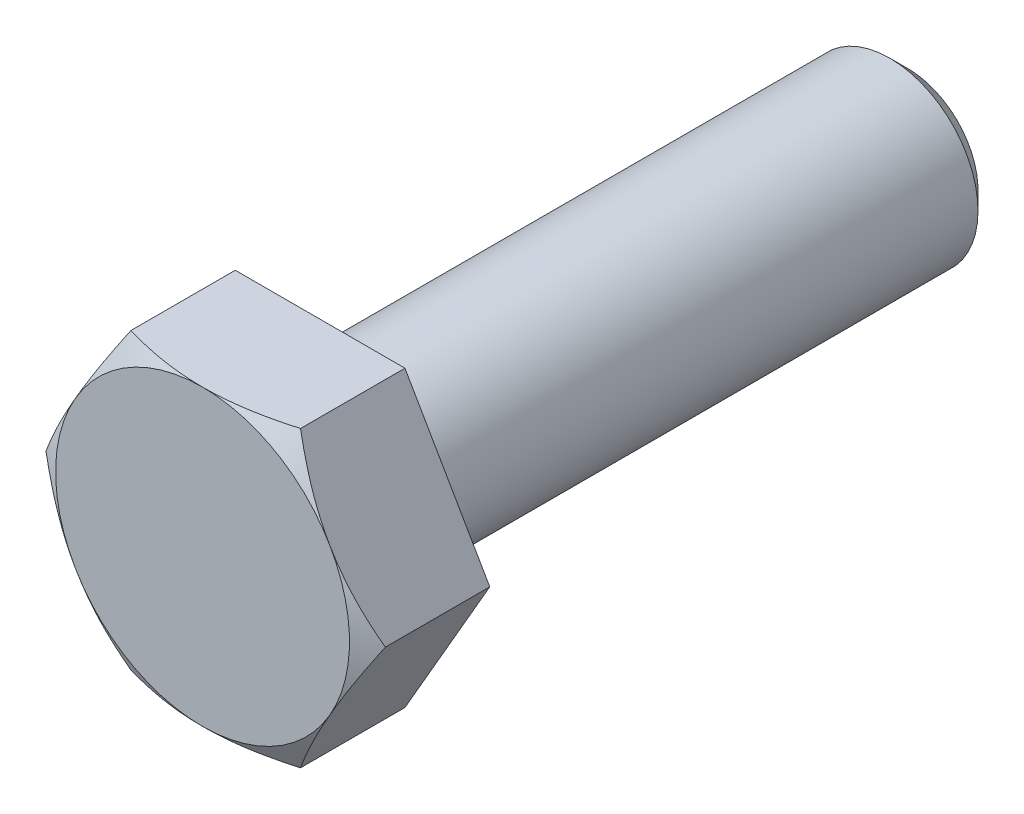
ISO-10303-21;
HEADER;
FILE_DESCRIPTION(('STEP AP214'),'2;1');
FILE_NAME('part.step','',(''),(''),'','','');
FILE_SCHEMA(('AUTOMOTIVE_DESIGN { 1 0 10303 214 1 1 1 1 }'));
ENDSEC;
DATA;
#1=APPLICATION_CONTEXT('core data for automotive mechanical design processes');
#2=APPLICATION_PROTOCOL_DEFINITION('international standard','automotive_design',2000,#1);
#3=PRODUCT_CONTEXT('',#1,'mechanical');
#4=PRODUCT('Part','Part','',(#3));
#5=PRODUCT_RELATED_PRODUCT_CATEGORY('part','',(#4));
#6=PRODUCT_DEFINITION_FORMATION('','',#4);
#7=PRODUCT_DEFINITION_CONTEXT('part definition',#1,'design');
#8=PRODUCT_DEFINITION('design','',#6,#7);
#9=PRODUCT_DEFINITION_SHAPE('','',#8);
#10=(LENGTH_UNIT() NAMED_UNIT(*) SI_UNIT(.MILLI.,.METRE.));
#11=(NAMED_UNIT(*) PLANE_ANGLE_UNIT() SI_UNIT($,.RADIAN.));
#12=(NAMED_UNIT(*) SI_UNIT($,.STERADIAN.) SOLID_ANGLE_UNIT());
#13=UNCERTAINTY_MEASURE_WITH_UNIT(LENGTH_MEASURE(1.E-05),#10,'distance_accuracy_value','');
#14=(GEOMETRIC_REPRESENTATION_CONTEXT(3) GLOBAL_UNCERTAINTY_ASSIGNED_CONTEXT((#13)) GLOBAL_UNIT_ASSIGNED_CONTEXT((#10,
#11,#12)) REPRESENTATION_CONTEXT('',''));
#15=CARTESIAN_POINT('',(0.,0.,0.));
#16=DIRECTION('',(0.,0.,1.));
#17=DIRECTION('',(1.,0.,0.));
#18=AXIS2_PLACEMENT_3D('',#15,#16,#17);
#19=CARTESIAN_POINT('',(-8.66025403784437,-5.,0.));
#20=DIRECTION('',(0.,0.,1.));
#21=DIRECTION('',(1.,0.,0.));
#22=AXIS2_PLACEMENT_3D('',#19,#20,#21);
#23=PLANE('',#22);
#24=CARTESIAN_POINT('',(0.,0.,0.));
#25=DIRECTION('',(0.,0.,1.));
#26=DIRECTION('',(1.,0.,0.));
#27=AXIS2_PLACEMENT_3D('',#24,#25,#26);
#28=CIRCLE('',#27,3.25);
#29=CARTESIAN_POINT('',(3.25,0.,0.));
#30=VERTEX_POINT('',#29);
#31=EDGE_CURVE('E11',#30,#30,#28,.T.);
#32=ORIENTED_EDGE('',*,*,#31,.T.);
#33=EDGE_LOOP('',(#32));
#34=FACE_BOUND('',#33,.T.);
#35=DIRECTION('',(-0.499999999999999,-0.866025403784439,0.));
#36=VECTOR('',#35,1.);
#37=CARTESIAN_POINT('',(-2.88675134594813,5.,0.));
#38=LINE('',#37,#36);
#39=CARTESIAN_POINT('',(-2.88675134594813,5.,0.));
#40=VERTEX_POINT('',#39);
#41=CARTESIAN_POINT('',(-5.77350269189626,0.,0.));
#42=VERTEX_POINT('',#41);
#43=EDGE_CURVE('E123',#40,#42,#38,.T.);
#44=ORIENTED_EDGE('',*,*,#43,.F.);
#45=DIRECTION('',(1.,0.,0.));
#46=VECTOR('',#45,1.);
#47=CARTESIAN_POINT('',(-2.88675134594813,5.,0.));
#48=LINE('',#47,#46);
#49=CARTESIAN_POINT('',(2.88675134594812,5.,0.));
#50=VERTEX_POINT('',#49);
#51=EDGE_CURVE('E255',#40,#50,#48,.T.);
#52=ORIENTED_EDGE('',*,*,#51,.T.);
#53=DIRECTION('',(0.5,-0.866025403784438,0.));
#54=VECTOR('',#53,1.);
#55=CARTESIAN_POINT('',(2.88675134594812,5.,0.));
#56=LINE('',#55,#54);
#57=CARTESIAN_POINT('',(5.77350269189626,0.,0.));
#58=VERTEX_POINT('',#57);
#59=EDGE_CURVE('E258',#50,#58,#56,.T.);
#60=ORIENTED_EDGE('',*,*,#59,.T.);
#61=DIRECTION('',(-0.5,-0.866025403784439,0.));
#62=VECTOR('',#61,1.);
#63=CARTESIAN_POINT('',(5.77350269189626,0.,0.));
#64=LINE('',#63,#62);
#65=CARTESIAN_POINT('',(2.88675134594813,-5.,0.));
#66=VERTEX_POINT('',#65);
#67=EDGE_CURVE('E261',#58,#66,#64,.T.);
#68=ORIENTED_EDGE('',*,*,#67,.T.);
#69=DIRECTION('',(1.,0.,0.));
#70=VECTOR('',#69,1.);
#71=CARTESIAN_POINT('',(-2.88675134594813,-5.,0.));
#72=LINE('',#71,#70);
#73=CARTESIAN_POINT('',(-2.88675134594813,-5.,0.));
#74=VERTEX_POINT('',#73);
#75=EDGE_CURVE('E246',#74,#66,#72,.T.);
#76=ORIENTED_EDGE('',*,*,#75,.F.);
#77=DIRECTION('',(0.5,-0.866025403784439,0.));
#78=VECTOR('',#77,1.);
#79=CARTESIAN_POINT('',(-5.77350269189626,0.,0.));
#80=LINE('',#79,#78);
#81=EDGE_CURVE('E264',#42,#74,#80,.T.);
#82=ORIENTED_EDGE('',*,*,#81,.F.);
#83=EDGE_LOOP('',(#44,#52,#60,#68,#76,#82));
#84=FACE_BOUND('',#83,.T.);
#85=ADVANCED_FACE('F31',(#34,#84),#23,.F.);
#86=CARTESIAN_POINT('',(-2.88675134594813,5.,4.));
#87=DIRECTION('',(0.866025403784439,-0.499999999999999,0.));
#88=DIRECTION('',(0.499999999999999,0.866025403784439,0.));
#89=AXIS2_PLACEMENT_3D('',#86,#87,#88);
#90=PLANE('',#89);
#91=DIRECTION('',(0.,0.,-1.));
#92=VECTOR('',#91,1.);
#93=CARTESIAN_POINT('',(-5.77350269189626,0.,4.));
#94=LINE('',#93,#92);
#95=CARTESIAN_POINT('',(-5.77350269189626,0.,3.5534180126148));
#96=VERTEX_POINT('',#95);
#97=EDGE_CURVE('E116',#96,#42,#94,.T.);
#98=ORIENTED_EDGE('',*,*,#97,.F.);
#99=CARTESIAN_POINT('',(-5.77361816195009,-0.000200000000005782,3.55335134394818));
#100=CARTESIAN_POINT('',(-5.6467543346507,0.219534594525179,3.62661343236237));
#101=CARTESIAN_POINT('',(-5.5188054379059,0.441148584459574,3.69324867808191));
#102=CARTESIAN_POINT('',(-5.26069210252318,0.888213995453507,3.80956100898919));
#103=CARTESIAN_POINT('',(-5.13052307794721,1.11367335959077,3.85919695008421));
#104=CARTESIAN_POINT('',(-4.87177839004641,1.5618323052235,3.9364489745813));
#105=CARTESIAN_POINT('',(-4.74324302208387,1.78446209310419,3.96457962171651));
#106=CARTESIAN_POINT('',(-4.54998783160117,2.11918990184663,3.98980507804631));
#107=CARTESIAN_POINT('',(-4.48552534905128,2.23084219680505,3.99538654023052));
#108=CARTESIAN_POINT('',(-4.35654081066911,2.45424997067379,4.00079778324853));
#109=CARTESIAN_POINT('',(-4.2920187567385,2.56600544629031,4.0006277417418));
#110=CARTESIAN_POINT('',(-4.11524635305245,2.87218423085063,3.99224636820796));
#111=CARTESIAN_POINT('',(-4.00305457769146,3.06650608596721,3.97817022810275));
#112=CARTESIAN_POINT('',(-3.77941563226458,3.4538601019977,3.93353474289057));
#113=CARTESIAN_POINT('',(-3.66796924828419,3.64689090137157,3.90296013985249));
#114=CARTESIAN_POINT('',(-3.44387972423144,4.03502534247485,3.82653150637884));
#115=CARTESIAN_POINT('',(-3.3312648659868,4.23007999864173,3.78035362112132));
#116=CARTESIAN_POINT('',(-3.10771464157941,4.61728034535877,3.67554820550807));
#117=CARTESIAN_POINT('',(-2.99677641204847,4.80943099540808,3.61694529656263));
#118=CARTESIAN_POINT('',(-2.88663587589429,5.0002,3.55335134394817));
#119=B_SPLINE_CURVE_WITH_KNOTS('',3,(#99,#100,#101,#102,#103,#104,#105,#106,#107,#108,#109,#110,
#111,#112,#113,#114,#115,#116,#117,#118),.UNSPECIFIED.,.F.,.F.,(4,2,2,2,2,2,2,2,2,4),(0.,
0.792555841363089,1.58701660053333,2.3618153748728,2.74884076077325,3.13585419177294,
3.80962362599679,4.48401723901189,5.17336882348928,5.86136694793725),.UNSPECIFIED.);
#120=CARTESIAN_POINT('',(-4.3301270189222,2.49999999999999,4.));
#121=VERTEX_POINT('',#120);
#122=EDGE_CURVE('E101',#96,#121,#119,.T.);
#123=ORIENTED_EDGE('',*,*,#122,.T.);
#124=CARTESIAN_POINT('',(-2.88675134594813,5.,3.5534180126148));
#125=VERTEX_POINT('',#124);
#126=EDGE_CURVE('E109',#121,#125,#119,.T.);
#127=ORIENTED_EDGE('',*,*,#126,.T.);
#128=DIRECTION('',(0.,0.,-1.));
#129=VECTOR('',#128,1.);
#130=CARTESIAN_POINT('',(-2.88675134594813,5.,4.));
#131=LINE('',#130,#129);
#132=EDGE_CURVE('E253',#125,#40,#131,.T.);
#133=ORIENTED_EDGE('',*,*,#132,.T.);
#134=ORIENTED_EDGE('',*,*,#43,.T.);
#135=EDGE_LOOP('',(#98,#123,#127,#133,#134));
#136=FACE_BOUND('',#135,.T.);
#137=ADVANCED_FACE('F121',(#136),#90,.F.);
#138=CARTESIAN_POINT('',(-5.77350269189626,0.,4.));
#139=DIRECTION('',(0.866025403784439,0.5,0.));
#140=DIRECTION('',(-0.5,0.866025403784439,0.));
#141=AXIS2_PLACEMENT_3D('',#138,#139,#140);
#142=PLANE('',#141);
#143=DIRECTION('',(0.,0.,-1.));
#144=VECTOR('',#143,1.);
#145=CARTESIAN_POINT('',(-2.88675134594813,-5.,4.));
#146=LINE('',#145,#144);
#147=CARTESIAN_POINT('',(-2.88675134594812,-5.,3.5534180126148));
#148=VERTEX_POINT('',#147);
#149=EDGE_CURVE('E125',#148,#74,#146,.T.);
#150=ORIENTED_EDGE('',*,*,#149,.F.);
#151=CARTESIAN_POINT('',(-2.88663587589429,-5.0002,3.55335134394817));
#152=CARTESIAN_POINT('',(-3.01349970319368,-4.78046540547482,3.62661343236237));
#153=CARTESIAN_POINT('',(-3.14144859993849,-4.55885141554042,3.69324867808191));
#154=CARTESIAN_POINT('',(-3.39956193532121,-4.11178600454649,3.80956100898919));
#155=CARTESIAN_POINT('',(-3.52973095989718,-3.88632664040923,3.85919695008421));
#156=CARTESIAN_POINT('',(-3.78847564779798,-3.43816769477649,3.9364489745813));
#157=CARTESIAN_POINT('',(-3.91701101576052,-3.21553790689581,3.96457962171651));
#158=CARTESIAN_POINT('',(-4.11026620624322,-2.88081009815336,3.98980507804631));
#159=CARTESIAN_POINT('',(-4.17472868879311,-2.76915780319494,3.99538654023051));
#160=CARTESIAN_POINT('',(-4.30371322717528,-2.54575002932621,4.00079778324853));
#161=CARTESIAN_POINT('',(-4.36823528110589,-2.43399455370969,4.00062774174179));
#162=CARTESIAN_POINT('',(-4.54500768479194,-2.12781576914936,3.99224636820796));
#163=CARTESIAN_POINT('',(-4.65719946015292,-1.93349391403279,3.97817022810275));
#164=CARTESIAN_POINT('',(-4.88083840557981,-1.5461398980023,3.93353474289057));
#165=CARTESIAN_POINT('',(-4.9922847895602,-1.35310909862843,3.90296013985249));
#166=CARTESIAN_POINT('',(-5.21637431361295,-0.96497465752515,3.82653150637884));
#167=CARTESIAN_POINT('',(-5.32898917185759,-0.769920001358269,3.78035362112132));
#168=CARTESIAN_POINT('',(-5.55253939626498,-0.382719654641237,3.67554820550807));
#169=CARTESIAN_POINT('',(-5.66347762579591,-0.190569004591919,3.61694529656263));
#170=CARTESIAN_POINT('',(-5.77361816195009,0.000199999999993787,3.55335134394818));
#171=B_SPLINE_CURVE_WITH_KNOTS('',3,(#151,#152,#153,#154,#155,#156,#157,#158,#159,#160,#161,
#162,#163,#164,#165,#166,#167,#168,#169,#170),.UNSPECIFIED.,.F.,.F.,(4,2,2,2,2,2,2,2,2,4),(0.,
0.79255584136309,1.58701660053333,2.3618153748728,2.74884076077325,3.13585419177295,
3.80962362599679,4.48401723901189,5.17336882348928,5.86136694793725),.UNSPECIFIED.);
#172=CARTESIAN_POINT('',(-4.33012701892219,-2.5,4.));
#173=VERTEX_POINT('',#172);
#174=EDGE_CURVE('E118',#148,#173,#171,.T.);
#175=ORIENTED_EDGE('',*,*,#174,.T.);
#176=EDGE_CURVE('E54',#173,#96,#171,.T.);
#177=ORIENTED_EDGE('',*,*,#176,.T.);
#178=ORIENTED_EDGE('',*,*,#97,.T.);
#179=ORIENTED_EDGE('',*,*,#81,.T.);
#180=EDGE_LOOP('',(#150,#175,#177,#178,#179));
#181=FACE_BOUND('',#180,.T.);
#182=ADVANCED_FACE('F114',(#181),#142,.F.);
#183=CARTESIAN_POINT('',(-2.88675134594813,-5.,4.));
#184=DIRECTION('',(0.,1.,0.));
#185=DIRECTION('',(0.,0.,1.));
#186=AXIS2_PLACEMENT_3D('',#183,#184,#185);
#187=PLANE('',#186);
#188=DIRECTION('',(0.,0.,-1.));
#189=VECTOR('',#188,1.);
#190=CARTESIAN_POINT('',(2.88675134594813,-5.,4.));
#191=LINE('',#190,#189);
#192=CARTESIAN_POINT('',(2.88675134594813,-5.,3.5534180126148));
#193=VERTEX_POINT('',#192);
#194=EDGE_CURVE('E131',#193,#66,#191,.T.);
#195=ORIENTED_EDGE('',*,*,#194,.F.);
#196=CARTESIAN_POINT('',(-7.65608998744865,-5.,1.60736647344924));
#197=CARTESIAN_POINT('',(-7.43656171400166,-5.,1.71345466182796));
#198=CARTESIAN_POINT('',(-7.21651440170021,-5.,1.81848824538408));
#199=CARTESIAN_POINT('',(-6.77510105921518,-5.,2.02584356636027));
#200=CARTESIAN_POINT('',(-6.55373480873052,-5.,2.12816483425435));
#201=CARTESIAN_POINT('',(-6.10820714710356,-5.,2.33003192146512));
#202=CARTESIAN_POINT('',(-5.88403698971124,-5.,2.42955850718272));
#203=CARTESIAN_POINT('',(-5.43385418074676,-5.,2.62433676721321));
#204=CARTESIAN_POINT('',(-5.20784162594277,-5.,2.71958866435759));
#205=CARTESIAN_POINT('',(-4.75080884782755,-5.,2.90581169081061));
#206=CARTESIAN_POINT('',(-4.51976121099505,-5.,2.99671590900132));
#207=CARTESIAN_POINT('',(-4.05494053422099,-5.,3.17140469702806));
#208=CARTESIAN_POINT('',(-3.82116719434024,-5.,3.25518847475236));
#209=CARTESIAN_POINT('',(-3.35100416711888,-5.,3.41338536763539));
#210=CARTESIAN_POINT('',(-3.11462125088187,-5.,3.48781840477474));
#211=CARTESIAN_POINT('',(-2.63849247870023,-5.,3.62489560612763));
#212=CARTESIAN_POINT('',(-2.3987477121033,-5.,3.68754349840305));
#213=CARTESIAN_POINT('',(-1.91574303714497,-5.,3.79801224600513));
#214=CARTESIAN_POINT('',(-1.672482210841,-5.,3.84582915344136));
#215=CARTESIAN_POINT('',(-1.18299359688664,-5.,3.9234044442076));
#216=CARTESIAN_POINT('',(-0.93676580661328,-5.,3.95316281157159));
#217=CARTESIAN_POINT('',(-0.567032279323847,-5.,3.9823487984137));
#218=CARTESIAN_POINT('',(-0.44410529765854,-5.,3.98950368094005));
#219=CARTESIAN_POINT('',(-0.198053005238565,-5.,3.99860454773096));
#220=CARTESIAN_POINT('',(-0.0749276970802291,-5.,4.00055059963961));
#221=CARTESIAN_POINT('',(0.171257999892353,-5.,3.99918152965433));
#222=CARTESIAN_POINT('',(0.294318397227088,-5.,3.99586788568699));
#223=CARTESIAN_POINT('',(0.54019273078884,-5.,3.98406340271724));
#224=CARTESIAN_POINT('',(0.663006654263483,-5.,3.97557230242983));
#225=CARTESIAN_POINT('',(0.96068187288167,-5.,3.9488936197247));
#226=CARTESIAN_POINT('',(1.1353143627994,-5.,3.92811103230171));
#227=CARTESIAN_POINT('',(1.4832167579939,-5.,3.8772343442773));
#228=CARTESIAN_POINT('',(1.65648647841238,-5.,3.84713900200996));
#229=CARTESIAN_POINT('',(2.00155426058702,-5.,3.77870120798844));
#230=CARTESIAN_POINT('',(2.17335067370376,-5.,3.74035052251359));
#231=CARTESIAN_POINT('',(2.51518168221058,-5.,3.65657169461498));
#232=CARTESIAN_POINT('',(2.68521638419315,-5.,3.61114398308599));
#233=CARTESIAN_POINT('',(3.02770318928897,-5.,3.5131122179457));
#234=CARTESIAN_POINT('',(3.20011248435317,-5.,3.46035963617605));
#235=CARTESIAN_POINT('',(3.54310870430183,-5.,3.34964221269736));
#236=CARTESIAN_POINT('',(3.71369679659721,-5.,3.29168096609292));
#237=CARTESIAN_POINT('',(4.0523661026798,-5.,3.17174345927151));
#238=CARTESIAN_POINT('',(4.22045602230063,-5.,3.10979163457362));
#239=CARTESIAN_POINT('',(4.55533171687456,-5.,2.98225176586186));
#240=CARTESIAN_POINT('',(4.72211693321423,-5.,2.91666225221221));
#241=CARTESIAN_POINT('',(4.88829623733364,-5.,2.84961374182274));
#242=B_SPLINE_CURVE_WITH_KNOTS('',3,(#196,#197,#198,#199,#200,#201,#202,#203,#204,#205,#206,
#207,#208,#209,#210,#211,#212,#213,#214,#215,#216,#217,#218,#219,#220,#221,#222,#223,#224,#225,
#226,#227,#228,#229,#230,#231,#232,#233,#234,#235,#236,#237,#238,#239,#240,#241),.UNSPECIFIED.,
.F.,.F.,(4,2,2,2,2,2,2,2,2,2,2,2,2,2,2,2,2,2,2,2,2,2,4),(0.,0.73146474066535,1.46305528824908,
2.19883243307486,2.93457117856033,3.67934251246857,4.42419659013361,5.16743580871988,
5.91043951739337,6.65364083834805,7.39684281638514,7.76615414335455,8.13546067426609,
8.50466345177854,8.87388486298451,9.40118542949727,9.92855633110016,10.4564556797854,
10.9843228991235,11.5251202808281,12.0655472210641,12.6029322754131,13.1405360390026),.UNSPECIFIED.);
#243=CARTESIAN_POINT('',(0.,-5.,4.));
#244=VERTEX_POINT('',#243);
#245=EDGE_CURVE('E208',#193,#244,#242,.F.);
#246=ORIENTED_EDGE('',*,*,#245,.T.);
#247=EDGE_CURVE('E46',#244,#148,#242,.F.);
#248=ORIENTED_EDGE('',*,*,#247,.T.);
#249=ORIENTED_EDGE('',*,*,#149,.T.);
#250=ORIENTED_EDGE('',*,*,#75,.T.);
#251=EDGE_LOOP('',(#195,#246,#248,#249,#250));
#252=FACE_BOUND('',#251,.T.);
#253=ADVANCED_FACE('F224',(#252),#187,.F.);
#254=CARTESIAN_POINT('',(5.77350269189626,0.,4.));
#255=DIRECTION('',(0.866025403784439,-0.5,0.));
#256=DIRECTION('',(0.5,0.866025403784439,0.));
#257=AXIS2_PLACEMENT_3D('',#254,#255,#256);
#258=PLANE('',#257);
#259=CARTESIAN_POINT('',(2.88663587589429,-5.0002,3.55335134394817));
#260=CARTESIAN_POINT('',(3.01349970319368,-4.78046540547482,3.62661343236237));
#261=CARTESIAN_POINT('',(3.14144859993849,-4.55885141554042,3.69324867808191));
#262=CARTESIAN_POINT('',(3.39956193532121,-4.11178600454649,3.80956100898919));
#263=CARTESIAN_POINT('',(3.52973095989718,-3.88632664040923,3.85919695008421));
#264=CARTESIAN_POINT('',(3.78847564779797,-3.43816769477649,3.9364489745813));
#265=CARTESIAN_POINT('',(3.91701101576052,-3.21553790689581,3.96457962171651));
#266=CARTESIAN_POINT('',(4.11026620624322,-2.88081009815336,3.98980507804632));
#267=CARTESIAN_POINT('',(4.1747286887931,-2.76915780319494,3.99538654023052));
#268=CARTESIAN_POINT('',(4.30371322717527,-2.54575002932621,4.00079778324853));
#269=CARTESIAN_POINT('',(4.36823528110588,-2.43399455370969,4.0006277417418));
#270=CARTESIAN_POINT('',(4.54500768479194,-2.12781576914936,3.99224636820796));
#271=CARTESIAN_POINT('',(4.65719946015292,-1.93349391403279,3.97817022810275));
#272=CARTESIAN_POINT('',(4.88083840557981,-1.5461398980023,3.93353474289057));
#273=CARTESIAN_POINT('',(4.9922847895602,-1.35310909862843,3.90296013985249));
#274=CARTESIAN_POINT('',(5.21637431361295,-0.964974657525147,3.82653150637884));
#275=CARTESIAN_POINT('',(5.32898917185758,-0.769920001358266,3.78035362112132));
#276=CARTESIAN_POINT('',(5.55253939626498,-0.382719654641233,3.67554820550807));
#277=CARTESIAN_POINT('',(5.66347762579591,-0.190569004591914,3.61694529656263));
#278=CARTESIAN_POINT('',(5.77361816195009,0.000199999999999473,3.55335134394818));
#279=B_SPLINE_CURVE_WITH_KNOTS('',3,(#259,#260,#261,#262,#263,#264,#265,#266,#267,#268,#269,
#270,#271,#272,#273,#274,#275,#276,#277,#278),.UNSPECIFIED.,.F.,.F.,(4,2,2,2,2,2,2,2,2,4),(0.,
0.792555841363091,1.58701660053333,2.3618153748728,2.74884076077325,3.13585419177295,
3.80962362599679,4.48401723901189,5.17336882348928,5.86136694793725),.UNSPECIFIED.);
#280=CARTESIAN_POINT('',(4.33012701892219,-2.5,4.));
#281=VERTEX_POINT('',#280);
#282=EDGE_CURVE('E238',#193,#281,#279,.T.);
#283=ORIENTED_EDGE('',*,*,#282,.F.);
#284=ORIENTED_EDGE('',*,*,#194,.T.);
#285=ORIENTED_EDGE('',*,*,#67,.F.);
#286=DIRECTION('',(0.,0.,-1.));
#287=VECTOR('',#286,1.);
#288=CARTESIAN_POINT('',(5.77350269189626,0.,4.));
#289=LINE('',#288,#287);
#290=CARTESIAN_POINT('',(5.77350269189626,0.,3.5534180126148));
#291=VERTEX_POINT('',#290);
#292=EDGE_CURVE('E248',#291,#58,#289,.T.);
#293=ORIENTED_EDGE('',*,*,#292,.F.);
#294=EDGE_CURVE('E203',#281,#291,#279,.T.);
#295=ORIENTED_EDGE('',*,*,#294,.F.);
#296=EDGE_LOOP('',(#283,#284,#285,#293,#295));
#297=FACE_BOUND('',#296,.T.);
#298=ADVANCED_FACE('F227',(#297),#258,.T.);
#299=CARTESIAN_POINT('',(2.88675134594812,5.,4.));
#300=DIRECTION('',(0.866025403784438,0.5,0.));
#301=DIRECTION('',(-0.5,0.866025403784438,0.));
#302=AXIS2_PLACEMENT_3D('',#299,#300,#301);
#303=PLANE('',#302);
#304=CARTESIAN_POINT('',(5.77361816195009,-0.000200000000000131,3.55335134394818));
#305=CARTESIAN_POINT('',(5.6467543346507,0.219534594525185,3.62661343236237));
#306=CARTESIAN_POINT('',(5.51880543790589,0.44114858445958,3.69324867808191));
#307=CARTESIAN_POINT('',(5.26069210252318,0.888213995453511,3.80956100898919));
#308=CARTESIAN_POINT('',(5.13052307794721,1.11367335959077,3.85919695008421));
#309=CARTESIAN_POINT('',(4.87177839004641,1.56183230522351,3.9364489745813));
#310=CARTESIAN_POINT('',(4.74324302208387,1.78446209310419,3.96457962171651));
#311=CARTESIAN_POINT('',(4.54998783160116,2.11918990184664,3.98980507804632));
#312=CARTESIAN_POINT('',(4.48552534905128,2.23084219680506,3.99538654023052));
#313=CARTESIAN_POINT('',(4.35654081066911,2.45424997067379,4.00079778324853));
#314=CARTESIAN_POINT('',(4.2920187567385,2.56600544629031,4.0006277417418));
#315=CARTESIAN_POINT('',(4.11524635305244,2.87218423085063,3.99224636820796));
#316=CARTESIAN_POINT('',(4.00305457769146,3.06650608596721,3.97817022810275));
#317=CARTESIAN_POINT('',(3.77941563226457,3.4538601019977,3.93353474289057));
#318=CARTESIAN_POINT('',(3.66796924828418,3.64689090137157,3.90296013985249));
#319=CARTESIAN_POINT('',(3.44387972423144,4.03502534247485,3.82653150637884));
#320=CARTESIAN_POINT('',(3.3312648659868,4.23007999864173,3.78035362112132));
#321=CARTESIAN_POINT('',(3.1077146415794,4.61728034535877,3.67554820550807));
#322=CARTESIAN_POINT('',(2.99677641204847,4.80943099540808,3.61694529656263));
#323=CARTESIAN_POINT('',(2.88663587589429,5.0002,3.55335134394818));
#324=B_SPLINE_CURVE_WITH_KNOTS('',3,(#304,#305,#306,#307,#308,#309,#310,#311,#312,#313,#314,
#315,#316,#317,#318,#319,#320,#321,#322,#323),.UNSPECIFIED.,.F.,.F.,(4,2,2,2,2,2,2,2,2,4),(0.,
0.792555841363089,1.58701660053333,2.3618153748728,2.74884076077325,3.13585419177294,
3.80962362599679,4.48401723901189,5.17336882348928,5.86136694793725),.UNSPECIFIED.);
#325=CARTESIAN_POINT('',(4.33012701892219,2.5,4.));
#326=VERTEX_POINT('',#325);
#327=EDGE_CURVE('E270',#291,#326,#324,.T.);
#328=ORIENTED_EDGE('',*,*,#327,.F.);
#329=ORIENTED_EDGE('',*,*,#292,.T.);
#330=ORIENTED_EDGE('',*,*,#59,.F.);
#331=DIRECTION('',(0.,0.,-1.));
#332=VECTOR('',#331,1.);
#333=CARTESIAN_POINT('',(2.88675134594812,5.,4.));
#334=LINE('',#333,#332);
#335=CARTESIAN_POINT('',(2.88675134594813,5.,3.5534180126148));
#336=VERTEX_POINT('',#335);
#337=EDGE_CURVE('E249',#336,#50,#334,.T.);
#338=ORIENTED_EDGE('',*,*,#337,.F.);
#339=EDGE_CURVE('E185',#326,#336,#324,.T.);
#340=ORIENTED_EDGE('',*,*,#339,.F.);
#341=EDGE_LOOP('',(#328,#329,#330,#338,#340));
#342=FACE_BOUND('',#341,.T.);
#343=ADVANCED_FACE('F172',(#342),#303,.T.);
#344=CARTESIAN_POINT('',(-2.88675134594813,5.,4.));
#345=DIRECTION('',(0.,1.,0.));
#346=DIRECTION('',(0.,0.,1.));
#347=AXIS2_PLACEMENT_3D('',#344,#345,#346);
#348=PLANE('',#347);
#349=CARTESIAN_POINT('',(-7.65608998744865,5.,1.60736647344924));
#350=CARTESIAN_POINT('',(-7.43656171400166,5.,1.71345466182797));
#351=CARTESIAN_POINT('',(-7.21651440170021,5.,1.81848824538408));
#352=CARTESIAN_POINT('',(-6.77510105921518,5.,2.02584356636027));
#353=CARTESIAN_POINT('',(-6.55373480873052,5.,2.12816483425435));
#354=CARTESIAN_POINT('',(-6.10820714710357,5.,2.33003192146512));
#355=CARTESIAN_POINT('',(-5.88403698971124,5.,2.42955850718272));
#356=CARTESIAN_POINT('',(-5.43385418074677,5.,2.62433676721321));
#357=CARTESIAN_POINT('',(-5.20784162594278,5.,2.71958866435759));
#358=CARTESIAN_POINT('',(-4.75080884782756,5.,2.9058116908106));
#359=CARTESIAN_POINT('',(-4.51976121099505,5.,2.99671590900132));
#360=CARTESIAN_POINT('',(-4.05494053422099,5.,3.17140469702806));
#361=CARTESIAN_POINT('',(-3.82116719434024,5.,3.25518847475236));
#362=CARTESIAN_POINT('',(-3.35100416711889,5.,3.41338536763539));
#363=CARTESIAN_POINT('',(-3.11462125088188,5.,3.48781840477474));
#364=CARTESIAN_POINT('',(-2.63849247870023,5.,3.62489560612763));
#365=CARTESIAN_POINT('',(-2.3987477121033,5.,3.68754349840306));
#366=CARTESIAN_POINT('',(-1.91574303714497,5.,3.79801224600513));
#367=CARTESIAN_POINT('',(-1.672482210841,5.,3.84582915344136));
#368=CARTESIAN_POINT('',(-1.18299359688664,5.,3.9234044442076));
#369=CARTESIAN_POINT('',(-0.936765806613282,5.,3.95316281157159));
#370=CARTESIAN_POINT('',(-0.56703227932385,5.,3.9823487984137));
#371=CARTESIAN_POINT('',(-0.444105297658542,5.,3.98950368094005));
#372=CARTESIAN_POINT('',(-0.198053005238569,5.,3.99860454773096));
#373=CARTESIAN_POINT('',(-0.0749276970802328,5.,4.00055059963961));
#374=CARTESIAN_POINT('',(0.171257999892348,5.,3.99918152965434));
#375=CARTESIAN_POINT('',(0.294318397227083,5.,3.99586788568699));
#376=CARTESIAN_POINT('',(0.540192730788835,5.,3.98406340271724));
#377=CARTESIAN_POINT('',(0.663006654263477,5.,3.97557230242984));
#378=CARTESIAN_POINT('',(0.960681872881664,5.,3.9488936197247));
#379=CARTESIAN_POINT('',(1.1353143627994,5.,3.92811103230171));
#380=CARTESIAN_POINT('',(1.4832167579939,5.,3.87723434427731));
#381=CARTESIAN_POINT('',(1.65648647841237,5.,3.84713900200997));
#382=CARTESIAN_POINT('',(2.00155426058701,5.,3.77870120798845));
#383=CARTESIAN_POINT('',(2.17335067370375,5.,3.74035052251359));
#384=CARTESIAN_POINT('',(2.51518168221057,5.,3.65657169461499));
#385=CARTESIAN_POINT('',(2.68521638419313,5.,3.611143983086));
#386=CARTESIAN_POINT('',(3.02770318928895,5.,3.5131122179457));
#387=CARTESIAN_POINT('',(3.20011248435316,5.,3.46035963617605));
#388=CARTESIAN_POINT('',(3.54310870430181,5.,3.34964221269737));
#389=CARTESIAN_POINT('',(3.71369679659719,5.,3.29168096609292));
#390=CARTESIAN_POINT('',(4.05236610267979,5.,3.17174345927152));
#391=CARTESIAN_POINT('',(4.22045602230062,5.,3.10979163457363));
#392=CARTESIAN_POINT('',(4.55533171687455,5.,2.98225176586187));
#393=CARTESIAN_POINT('',(4.72211693321421,5.,2.91666225221222));
#394=CARTESIAN_POINT('',(4.88829623733363,5.,2.84961374182275));
#395=B_SPLINE_CURVE_WITH_KNOTS('',3,(#349,#350,#351,#352,#353,#354,#355,#356,#357,#358,#359,
#360,#361,#362,#363,#364,#365,#366,#367,#368,#369,#370,#371,#372,#373,#374,#375,#376,#377,#378,
#379,#380,#381,#382,#383,#384,#385,#386,#387,#388,#389,#390,#391,#392,#393,#394),.UNSPECIFIED.,
.F.,.F.,(4,2,2,2,2,2,2,2,2,2,2,2,2,2,2,2,2,2,2,2,2,2,4),(0.,0.73146474066535,1.46305528824908,
2.19883243307485,2.93457117856033,3.67934251246857,4.4241965901336,5.16743580871988,
5.91043951739337,6.65364083834805,7.39684281638514,7.76615414335454,8.13546067426608,
8.50466345177854,8.8738848629845,9.40118542949726,9.92855633110014,10.4564556797854,
10.9843228991235,11.525120280828,12.065547221064,12.6029322754131,13.1405360390026),.UNSPECIFIED.);
#396=CARTESIAN_POINT('',(0.,5.,4.));
#397=VERTEX_POINT('',#396);
#398=EDGE_CURVE('E183',#336,#397,#395,.F.);
#399=ORIENTED_EDGE('',*,*,#398,.F.);
#400=ORIENTED_EDGE('',*,*,#337,.T.);
#401=ORIENTED_EDGE('',*,*,#51,.F.);
#402=ORIENTED_EDGE('',*,*,#132,.F.);
#403=EDGE_CURVE('E177',#397,#125,#395,.F.);
#404=ORIENTED_EDGE('',*,*,#403,.F.);
#405=EDGE_LOOP('',(#399,#400,#401,#402,#404));
#406=FACE_BOUND('',#405,.T.);
#407=ADVANCED_FACE('F167',(#406),#348,.T.);
#408=CARTESIAN_POINT('',(0.,0.,4.));
#409=DIRECTION('',(0.,0.,-1.));
#410=DIRECTION('',(-1.,0.,0.));
#411=AXIS2_PLACEMENT_3D('',#408,#409,#410);
#412=CONICAL_SURFACE('',#411,5.,1.0471975511966);
#413=ORIENTED_EDGE('',*,*,#294,.T.);
#414=ORIENTED_EDGE('',*,*,#327,.T.);
#415=CARTESIAN_POINT('',(0.,0.,4.));
#416=DIRECTION('',(0.,0.,1.));
#417=DIRECTION('',(1.,0.,0.));
#418=AXIS2_PLACEMENT_3D('',#415,#416,#417);
#419=CIRCLE('',#418,5.);
#420=EDGE_CURVE('E124',#326,#281,#419,.F.);
#421=ORIENTED_EDGE('',*,*,#420,.T.);
#422=EDGE_LOOP('',(#413,#414,#421));
#423=FACE_BOUND('',#422,.T.);
#424=ADVANCED_FACE('F171',(#423),#412,.T.);
#425=ORIENTED_EDGE('',*,*,#339,.T.);
#426=ORIENTED_EDGE('',*,*,#398,.T.);
#427=EDGE_CURVE('E128',#397,#326,#419,.F.);
#428=ORIENTED_EDGE('',*,*,#427,.T.);
#429=EDGE_LOOP('',(#425,#426,#428));
#430=FACE_BOUND('',#429,.T.);
#431=ADVANCED_FACE('F190',(#430),#412,.T.);
#432=CARTESIAN_POINT('',(0.,0.,4.));
#433=DIRECTION('',(0.,0.,-1.));
#434=DIRECTION('',(-1.,0.,0.));
#435=AXIS2_PLACEMENT_3D('',#432,#433,#434);
#436=CIRCLE('',#435,5.);
#437=EDGE_CURVE('E184',#121,#397,#436,.T.);
#438=ORIENTED_EDGE('',*,*,#437,.T.);
#439=ORIENTED_EDGE('',*,*,#403,.T.);
#440=ORIENTED_EDGE('',*,*,#126,.F.);
#441=EDGE_LOOP('',(#438,#439,#440));
#442=FACE_BOUND('',#441,.T.);
#443=ADVANCED_FACE('F194',(#442),#412,.T.);
#444=EDGE_CURVE('E104',#173,#121,#419,.F.);
#445=ORIENTED_EDGE('',*,*,#444,.T.);
#446=ORIENTED_EDGE('',*,*,#122,.F.);
#447=ORIENTED_EDGE('',*,*,#176,.F.);
#448=EDGE_LOOP('',(#445,#446,#447));
#449=FACE_BOUND('',#448,.T.);
#450=ADVANCED_FACE('F102',(#449),#412,.T.);
#451=ORIENTED_EDGE('',*,*,#247,.F.);
#452=EDGE_CURVE('E283',#244,#173,#419,.F.);
#453=ORIENTED_EDGE('',*,*,#452,.T.);
#454=ORIENTED_EDGE('',*,*,#174,.F.);
#455=EDGE_LOOP('',(#451,#453,#454));
#456=FACE_BOUND('',#455,.T.);
#457=ADVANCED_FACE('F196',(#456),#412,.T.);
#458=ORIENTED_EDGE('',*,*,#282,.T.);
#459=EDGE_CURVE('E130',#281,#244,#419,.F.);
#460=ORIENTED_EDGE('',*,*,#459,.T.);
#461=ORIENTED_EDGE('',*,*,#245,.F.);
#462=EDGE_LOOP('',(#458,#460,#461));
#463=FACE_BOUND('',#462,.T.);
#464=ADVANCED_FACE('F284',(#463),#412,.T.);
#465=CARTESIAN_POINT('',(-8.66025403784437,-5.,4.));
#466=DIRECTION('',(0.,0.,1.));
#467=DIRECTION('',(1.,0.,0.));
#468=AXIS2_PLACEMENT_3D('',#465,#466,#467);
#469=PLANE('',#468);
#470=ORIENTED_EDGE('',*,*,#459,.F.);
#471=ORIENTED_EDGE('',*,*,#420,.F.);
#472=ORIENTED_EDGE('',*,*,#427,.F.);
#473=ORIENTED_EDGE('',*,*,#437,.F.);
#474=ORIENTED_EDGE('',*,*,#444,.F.);
#475=ORIENTED_EDGE('',*,*,#452,.F.);
#476=EDGE_LOOP('',(#470,#471,#472,#473,#474,#475));
#477=FACE_BOUND('',#476,.T.);
#478=ADVANCED_FACE('F165',(#477),#469,.T.);
#479=CARTESIAN_POINT('',(0.,0.,-20.));
#480=DIRECTION('',(0.,0.,1.));
#481=DIRECTION('',(1.,0.,0.));
#482=AXIS2_PLACEMENT_3D('',#479,#480,#481);
#483=CYLINDRICAL_SURFACE('',#482,3.);
#484=CARTESIAN_POINT('',(0.,0.,-0.25));
#485=DIRECTION('',(0.,0.,1.));
#486=DIRECTION('',(1.,0.,0.));
#487=AXIS2_PLACEMENT_3D('',#484,#485,#486);
#488=CIRCLE('',#487,3.);
#489=CARTESIAN_POINT('',(3.,0.,-0.25));
#490=VERTEX_POINT('',#489);
#491=EDGE_CURVE('E39',#490,#490,#488,.F.);
#492=ORIENTED_EDGE('',*,*,#491,.T.);
#493=EDGE_LOOP('',(#492));
#494=FACE_BOUND('',#493,.T.);
#495=CARTESIAN_POINT('',(0.,0.,-19.3866));
#496=DIRECTION('',(0.,0.,-1.));
#497=DIRECTION('',(-1.,0.,0.));
#498=AXIS2_PLACEMENT_3D('',#495,#496,#497);
#499=CIRCLE('',#498,3.);
#500=CARTESIAN_POINT('',(-3.,0.,-19.3866));
#501=VERTEX_POINT('',#500);
#502=EDGE_CURVE('E138',#501,#501,#499,.F.);
#503=ORIENTED_EDGE('',*,*,#502,.T.);
#504=EDGE_LOOP('',(#503));
#505=FACE_BOUND('',#504,.T.);
#506=ADVANCED_FACE('F143',(#494,#505),#483,.T.);
#507=CARTESIAN_POINT('',(0.,0.,-20.));
#508=DIRECTION('',(0.,0.,-1.));
#509=DIRECTION('',(-1.,0.,0.));
#510=AXIS2_PLACEMENT_3D('',#507,#508,#509);
#511=PLANE('',#510);
#512=CARTESIAN_POINT('',(0.,0.,-20.));
#513=DIRECTION('',(0.,0.,-1.));
#514=DIRECTION('',(-1.,0.,0.));
#515=AXIS2_PLACEMENT_3D('',#512,#513,#514);
#516=CIRCLE('',#515,2.38659999999999);
#517=CARTESIAN_POINT('',(-2.38659999999999,0.,-20.));
#518=VERTEX_POINT('',#517);
#519=EDGE_CURVE('E135',#518,#518,#516,.T.);
#520=ORIENTED_EDGE('',*,*,#519,.T.);
#521=EDGE_LOOP('',(#520));
#522=FACE_BOUND('',#521,.T.);
#523=ADVANCED_FACE('F152',(#522),#511,.T.);
#524=CARTESIAN_POINT('',(0.,0.,-20.));
#525=DIRECTION('',(0.,0.,1.));
#526=DIRECTION('',(1.,0.,0.));
#527=AXIS2_PLACEMENT_3D('',#524,#525,#526);
#528=CONICAL_SURFACE('',#527,2.38659999999999,0.785398163397454);
#529=ORIENTED_EDGE('',*,*,#502,.F.);
#530=EDGE_LOOP('',(#529));
#531=FACE_BOUND('',#530,.T.);
#532=ORIENTED_EDGE('',*,*,#519,.F.);
#533=EDGE_LOOP('',(#532));
#534=FACE_BOUND('',#533,.T.);
#535=ADVANCED_FACE('F147',(#531,#534),#528,.T.);
#536=CARTESIAN_POINT('',(0.,0.,-0.25));
#537=DIRECTION('',(0.,0.,1.));
#538=DIRECTION('',(1.,0.,0.));
#539=AXIS2_PLACEMENT_3D('',#536,#537,#538);
#540=TOROIDAL_SURFACE('',#539,3.25,0.25);
#541=ORIENTED_EDGE('',*,*,#31,.F.);
#542=EDGE_LOOP('',(#541));
#543=FACE_BOUND('',#542,.T.);
#544=ORIENTED_EDGE('',*,*,#491,.F.);
#545=EDGE_LOOP('',(#544));
#546=FACE_BOUND('',#545,.T.);
#547=ADVANCED_FACE('F33',(#543,#546),#540,.F.);
#548=CLOSED_SHELL('',(#85,#137,#182,#253,#298,#343,#407,#424,#431,#443,#450,#457,#464,#478,#506,
#523,#535,#547));
#549=MANIFOLD_SOLID_BREP('B2',#548);
#550=ADVANCED_BREP_SHAPE_REPRESENTATION('',(#18,#549),#14);
#551=SHAPE_DEFINITION_REPRESENTATION(#9,#550);
ENDSEC;
END-ISO-10303-21;
